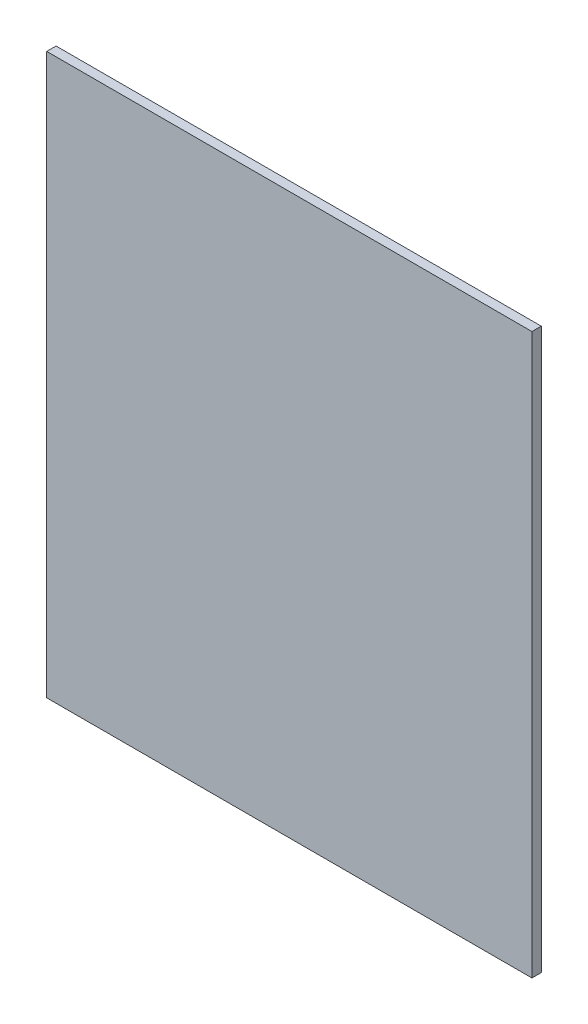
ISO-10303-21;
HEADER;
FILE_DESCRIPTION(('STEP AP214'),'2;1');
FILE_NAME('part.step','',(''),(''),'','','');
FILE_SCHEMA(('AUTOMOTIVE_DESIGN { 1 0 10303 214 1 1 1 1 }'));
ENDSEC;
DATA;
#1=APPLICATION_CONTEXT('core data for automotive mechanical design processes');
#2=APPLICATION_PROTOCOL_DEFINITION('international standard','automotive_design',2000,#1);
#3=PRODUCT_CONTEXT('',#1,'mechanical');
#4=PRODUCT('Part','Part','',(#3));
#5=PRODUCT_RELATED_PRODUCT_CATEGORY('part','',(#4));
#6=PRODUCT_DEFINITION_FORMATION('','',#4);
#7=PRODUCT_DEFINITION_CONTEXT('part definition',#1,'design');
#8=PRODUCT_DEFINITION('design','',#6,#7);
#9=PRODUCT_DEFINITION_SHAPE('','',#8);
#10=(LENGTH_UNIT() NAMED_UNIT(*) SI_UNIT(.MILLI.,.METRE.));
#11=(NAMED_UNIT(*) PLANE_ANGLE_UNIT() SI_UNIT($,.RADIAN.));
#12=(NAMED_UNIT(*) SI_UNIT($,.STERADIAN.) SOLID_ANGLE_UNIT());
#13=UNCERTAINTY_MEASURE_WITH_UNIT(LENGTH_MEASURE(1.E-05),#10,'distance_accuracy_value','');
#14=(GEOMETRIC_REPRESENTATION_CONTEXT(3) GLOBAL_UNCERTAINTY_ASSIGNED_CONTEXT((#13)) GLOBAL_UNIT_ASSIGNED_CONTEXT((#10,
#11,#12)) REPRESENTATION_CONTEXT('',''));
#15=CARTESIAN_POINT('',(0.,0.,0.));
#16=DIRECTION('',(0.,0.,1.));
#17=DIRECTION('',(1.,0.,0.));
#18=AXIS2_PLACEMENT_3D('',#15,#16,#17);
#19=CARTESIAN_POINT('',(-130.,-150.,5.));
#20=DIRECTION('',(1.,0.,0.));
#21=DIRECTION('',(0.,0.,-1.));
#22=AXIS2_PLACEMENT_3D('',#19,#20,#21);
#23=PLANE('',#22);
#24=DIRECTION('',(0.,-1.,0.));
#25=VECTOR('',#24,1.);
#26=CARTESIAN_POINT('',(-130.,-150.,0.));
#27=LINE('',#26,#25);
#28=CARTESIAN_POINT('',(-130.,150.,0.));
#29=VERTEX_POINT('',#28);
#30=CARTESIAN_POINT('',(-130.,-150.,0.));
#31=VERTEX_POINT('',#30);
#32=EDGE_CURVE('E96',#29,#31,#27,.T.);
#33=ORIENTED_EDGE('',*,*,#32,.T.);
#34=DIRECTION('',(0.,0.,-1.));
#35=VECTOR('',#34,1.);
#36=CARTESIAN_POINT('',(-130.,-150.,5.));
#37=LINE('',#36,#35);
#38=CARTESIAN_POINT('',(-130.,-150.,5.));
#39=VERTEX_POINT('',#38);
#40=EDGE_CURVE('E11',#39,#31,#37,.T.);
#41=ORIENTED_EDGE('',*,*,#40,.F.);
#42=DIRECTION('',(0.,-1.,0.));
#43=VECTOR('',#42,1.);
#44=CARTESIAN_POINT('',(-130.,-150.,5.));
#45=LINE('',#44,#43);
#46=CARTESIAN_POINT('',(-130.,150.,5.));
#47=VERTEX_POINT('',#46);
#48=EDGE_CURVE('E84',#47,#39,#45,.T.);
#49=ORIENTED_EDGE('',*,*,#48,.F.);
#50=DIRECTION('',(0.,0.,-1.));
#51=VECTOR('',#50,1.);
#52=CARTESIAN_POINT('',(-130.,150.,5.));
#53=LINE('',#52,#51);
#54=EDGE_CURVE('E92',#47,#29,#53,.T.);
#55=ORIENTED_EDGE('',*,*,#54,.T.);
#56=EDGE_LOOP('',(#33,#41,#49,#55));
#57=FACE_BOUND('',#56,.T.);
#58=ADVANCED_FACE('F33',(#57),#23,.F.);
#59=CARTESIAN_POINT('',(130.,-150.,5.));
#60=DIRECTION('',(0.,1.,0.));
#61=DIRECTION('',(-1.,0.,0.));
#62=AXIS2_PLACEMENT_3D('',#59,#60,#61);
#63=PLANE('',#62);
#64=DIRECTION('',(1.,0.,0.));
#65=VECTOR('',#64,1.);
#66=CARTESIAN_POINT('',(130.,-150.,0.));
#67=LINE('',#66,#65);
#68=CARTESIAN_POINT('',(130.,-150.,0.));
#69=VERTEX_POINT('',#68);
#70=EDGE_CURVE('E88',#31,#69,#67,.T.);
#71=ORIENTED_EDGE('',*,*,#70,.T.);
#72=DIRECTION('',(0.,0.,-1.));
#73=VECTOR('',#72,1.);
#74=CARTESIAN_POINT('',(130.,-150.,5.));
#75=LINE('',#74,#73);
#76=CARTESIAN_POINT('',(130.,-150.,5.));
#77=VERTEX_POINT('',#76);
#78=EDGE_CURVE('E41',#77,#69,#75,.T.);
#79=ORIENTED_EDGE('',*,*,#78,.F.);
#80=DIRECTION('',(1.,0.,0.));
#81=VECTOR('',#80,1.);
#82=CARTESIAN_POINT('',(130.,-150.,5.));
#83=LINE('',#82,#81);
#84=EDGE_CURVE('E79',#39,#77,#83,.T.);
#85=ORIENTED_EDGE('',*,*,#84,.F.);
#86=ORIENTED_EDGE('',*,*,#40,.T.);
#87=EDGE_LOOP('',(#71,#79,#85,#86));
#88=FACE_BOUND('',#87,.T.);
#89=ADVANCED_FACE('F87',(#88),#63,.F.);
#90=CARTESIAN_POINT('',(130.,-150.,5.));
#91=DIRECTION('',(-1.,0.,0.));
#92=DIRECTION('',(0.,0.,1.));
#93=AXIS2_PLACEMENT_3D('',#90,#91,#92);
#94=PLANE('',#93);
#95=DIRECTION('',(0.,1.,0.));
#96=VECTOR('',#95,1.);
#97=CARTESIAN_POINT('',(130.,-150.,0.));
#98=LINE('',#97,#96);
#99=CARTESIAN_POINT('',(130.,150.,0.));
#100=VERTEX_POINT('',#99);
#101=EDGE_CURVE('E66',#69,#100,#98,.T.);
#102=ORIENTED_EDGE('',*,*,#101,.T.);
#103=DIRECTION('',(0.,0.,-1.));
#104=VECTOR('',#103,1.);
#105=CARTESIAN_POINT('',(130.,150.,5.));
#106=LINE('',#105,#104);
#107=CARTESIAN_POINT('',(130.,150.,5.));
#108=VERTEX_POINT('',#107);
#109=EDGE_CURVE('E89',#108,#100,#106,.T.);
#110=ORIENTED_EDGE('',*,*,#109,.F.);
#111=DIRECTION('',(0.,1.,0.));
#112=VECTOR('',#111,1.);
#113=CARTESIAN_POINT('',(130.,-150.,5.));
#114=LINE('',#113,#112);
#115=EDGE_CURVE('E82',#77,#108,#114,.T.);
#116=ORIENTED_EDGE('',*,*,#115,.F.);
#117=ORIENTED_EDGE('',*,*,#78,.T.);
#118=EDGE_LOOP('',(#102,#110,#116,#117));
#119=FACE_BOUND('',#118,.T.);
#120=ADVANCED_FACE('F90',(#119),#94,.F.);
#121=CARTESIAN_POINT('',(130.,150.,5.));
#122=DIRECTION('',(0.,-1.,0.));
#123=DIRECTION('',(1.,0.,0.));
#124=AXIS2_PLACEMENT_3D('',#121,#122,#123);
#125=PLANE('',#124);
#126=DIRECTION('',(-1.,0.,0.));
#127=VECTOR('',#126,1.);
#128=CARTESIAN_POINT('',(130.,150.,0.));
#129=LINE('',#128,#127);
#130=EDGE_CURVE('E72',#100,#29,#129,.T.);
#131=ORIENTED_EDGE('',*,*,#130,.T.);
#132=ORIENTED_EDGE('',*,*,#54,.F.);
#133=DIRECTION('',(-1.,0.,0.));
#134=VECTOR('',#133,1.);
#135=CARTESIAN_POINT('',(130.,150.,5.));
#136=LINE('',#135,#134);
#137=EDGE_CURVE('E49',#108,#47,#136,.T.);
#138=ORIENTED_EDGE('',*,*,#137,.F.);
#139=ORIENTED_EDGE('',*,*,#109,.T.);
#140=EDGE_LOOP('',(#131,#132,#138,#139));
#141=FACE_BOUND('',#140,.T.);
#142=ADVANCED_FACE('F103',(#141),#125,.F.);
#143=CARTESIAN_POINT('',(0.,0.,5.));
#144=DIRECTION('',(0.,0.,1.));
#145=DIRECTION('',(1.,0.,0.));
#146=AXIS2_PLACEMENT_3D('',#143,#144,#145);
#147=PLANE('',#146);
#148=ORIENTED_EDGE('',*,*,#48,.T.);
#149=ORIENTED_EDGE('',*,*,#84,.T.);
#150=ORIENTED_EDGE('',*,*,#115,.T.);
#151=ORIENTED_EDGE('',*,*,#137,.T.);
#152=EDGE_LOOP('',(#148,#149,#150,#151));
#153=FACE_BOUND('',#152,.T.);
#154=ADVANCED_FACE('F80',(#153),#147,.T.);
#155=CARTESIAN_POINT('',(0.,0.,0.));
#156=DIRECTION('',(0.,0.,1.));
#157=DIRECTION('',(1.,0.,0.));
#158=AXIS2_PLACEMENT_3D('',#155,#156,#157);
#159=PLANE('',#158);
#160=ORIENTED_EDGE('',*,*,#32,.F.);
#161=ORIENTED_EDGE('',*,*,#130,.F.);
#162=ORIENTED_EDGE('',*,*,#101,.F.);
#163=ORIENTED_EDGE('',*,*,#70,.F.);
#164=EDGE_LOOP('',(#160,#161,#162,#163));
#165=FACE_BOUND('',#164,.T.);
#166=ADVANCED_FACE('F106',(#165),#159,.F.);
#167=CLOSED_SHELL('',(#58,#89,#120,#142,#154,#166));
#168=MANIFOLD_SOLID_BREP('B2',#167);
#169=ADVANCED_BREP_SHAPE_REPRESENTATION('',(#18,#168),#14);
#170=SHAPE_DEFINITION_REPRESENTATION(#9,#169);
ENDSEC;
END-ISO-10303-21;
